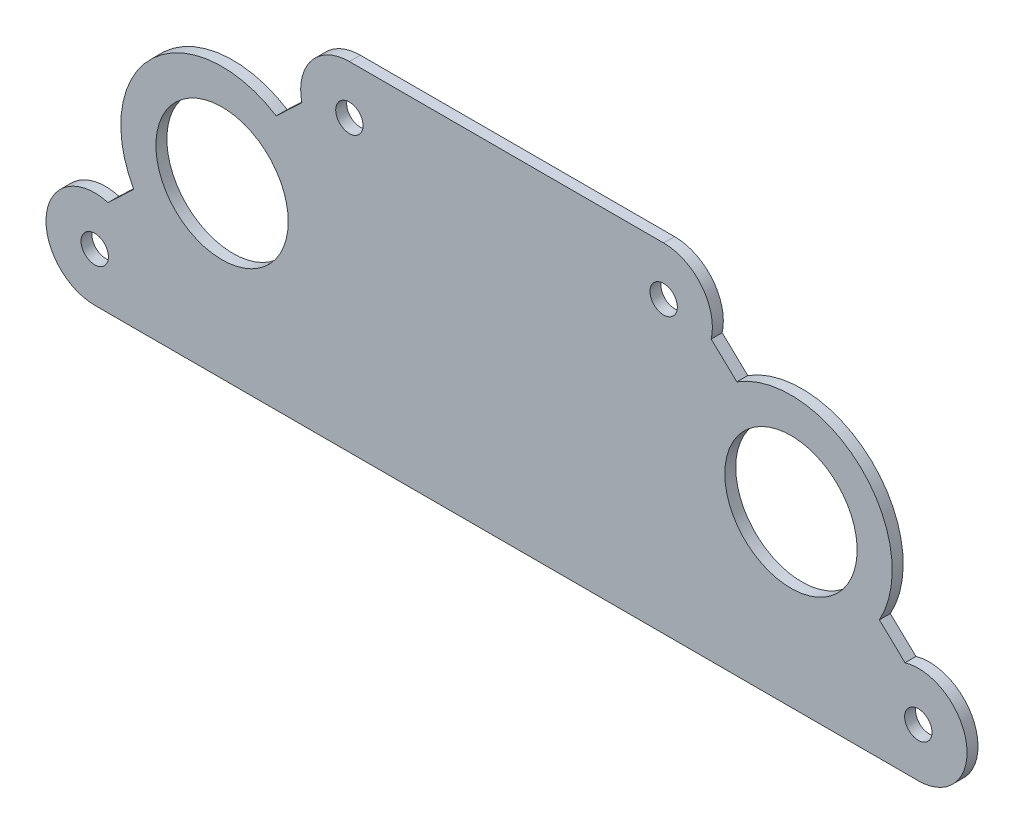
ISO-10303-21;
HEADER;
FILE_DESCRIPTION(('STEP AP214'),'2;1');
FILE_NAME('part.step','',(''),(''),'','','');
FILE_SCHEMA(('AUTOMOTIVE_DESIGN { 1 0 10303 214 1 1 1 1 }'));
ENDSEC;
DATA;
#1=APPLICATION_CONTEXT('core data for automotive mechanical design processes');
#2=APPLICATION_PROTOCOL_DEFINITION('international standard','automotive_design',2000,#1);
#3=PRODUCT_CONTEXT('',#1,'mechanical');
#4=PRODUCT('Part','Part','',(#3));
#5=PRODUCT_RELATED_PRODUCT_CATEGORY('part','',(#4));
#6=PRODUCT_DEFINITION_FORMATION('','',#4);
#7=PRODUCT_DEFINITION_CONTEXT('part definition',#1,'design');
#8=PRODUCT_DEFINITION('design','',#6,#7);
#9=PRODUCT_DEFINITION_SHAPE('','',#8);
#10=(LENGTH_UNIT() NAMED_UNIT(*) SI_UNIT(.MILLI.,.METRE.));
#11=(NAMED_UNIT(*) PLANE_ANGLE_UNIT() SI_UNIT($,.RADIAN.));
#12=(NAMED_UNIT(*) SI_UNIT($,.STERADIAN.) SOLID_ANGLE_UNIT());
#13=UNCERTAINTY_MEASURE_WITH_UNIT(LENGTH_MEASURE(1.E-05),#10,'distance_accuracy_value','');
#14=(GEOMETRIC_REPRESENTATION_CONTEXT(3) GLOBAL_UNCERTAINTY_ASSIGNED_CONTEXT((#13)) GLOBAL_UNIT_ASSIGNED_CONTEXT((#10,
#11,#12)) REPRESENTATION_CONTEXT('',''));
#15=CARTESIAN_POINT('',(0.,0.,0.));
#16=DIRECTION('',(0.,0.,1.));
#17=DIRECTION('',(1.,0.,0.));
#18=AXIS2_PLACEMENT_3D('',#15,#16,#17);
#19=CARTESIAN_POINT('',(-37.4491773298675,20.6057630346768,1.5875));
#20=DIRECTION('',(0.,0.,-1.));
#21=DIRECTION('',(-1.,0.,0.));
#22=AXIS2_PLACEMENT_3D('',#19,#20,#21);
#23=PLANE('',#22);
#24=CARTESIAN_POINT('',(-74.3479528827939,55.5216671858621,1.5875));
#25=DIRECTION('',(0.,0.,1.));
#26=DIRECTION('',(-1.,0.,0.));
#27=AXIS2_PLACEMENT_3D('',#24,#25,#26);
#28=CIRCLE('',#27,1.9812);
#29=CARTESIAN_POINT('',(-76.3291528827939,55.5216671858621,1.5875));
#30=VERTEX_POINT('',#29);
#31=EDGE_CURVE('E302',#30,#30,#28,.T.);
#32=ORIENTED_EDGE('',*,*,#31,.F.);
#33=EDGE_LOOP('',(#32));
#34=FACE_BOUND('',#33,.T.);
#35=CARTESIAN_POINT('',(-156.779774807812,20.6057630346768,1.5875));
#36=DIRECTION('',(0.,0.,1.));
#37=DIRECTION('',(1.,0.,0.));
#38=AXIS2_PLACEMENT_3D('',#35,#36,#37);
#39=CIRCLE('',#38,1.9812);
#40=CARTESIAN_POINT('',(-154.798574807812,20.6057630346768,1.5875));
#41=VERTEX_POINT('',#40);
#42=EDGE_CURVE('E314',#41,#41,#39,.T.);
#43=ORIENTED_EDGE('',*,*,#42,.F.);
#44=EDGE_LOOP('',(#43));
#45=FACE_BOUND('',#44,.T.);
#46=CARTESIAN_POINT('',(-138.330387031349,38.0637151102694,1.5875));
#47=DIRECTION('',(0.,0.,1.));
#48=DIRECTION('',(1.,0.,0.));
#49=AXIS2_PLACEMENT_3D('',#46,#47,#48);
#50=CIRCLE('',#49,9.5885);
#51=CARTESIAN_POINT('',(-128.741887031349,38.0637151102694,1.5875));
#52=VERTEX_POINT('',#51);
#53=EDGE_CURVE('E160',#52,#52,#50,.T.);
#54=ORIENTED_EDGE('',*,*,#53,.F.);
#55=EDGE_LOOP('',(#54));
#56=FACE_BOUND('',#55,.T.);
#57=CARTESIAN_POINT('',(-37.4491773298675,20.6057630346768,1.5875));
#58=DIRECTION('',(0.,0.,1.));
#59=DIRECTION('',(-1.,0.,0.));
#60=AXIS2_PLACEMENT_3D('',#57,#58,#59);
#61=CIRCLE('',#60,7.06119999999999);
#62=CARTESIAN_POINT('',(-37.4491773298676,13.5445630346768,1.5875));
#63=VERTEX_POINT('',#62);
#64=CARTESIAN_POINT('',(-39.3760586747717,27.39897094572,1.5875));
#65=VERTEX_POINT('',#64);
#66=EDGE_CURVE('E179',#63,#65,#61,.T.);
#67=ORIENTED_EDGE('',*,*,#66,.T.);
#68=DIRECTION('',(-0.726353849467055,0.68732094785798,0.));
#69=VECTOR('',#68,1.);
#70=CARTESIAN_POINT('',(-39.3760586747717,27.39897094572,1.5875));
#71=LINE('',#70,#69);
#72=CARTESIAN_POINT('',(-43.0905728629608,30.9138740670172,1.5875));
#73=VERTEX_POINT('',#72);
#74=EDGE_CURVE('E107',#65,#73,#71,.T.);
#75=ORIENTED_EDGE('',*,*,#74,.T.);
#76=CARTESIAN_POINT('',(-55.8985651063307,38.0637151102694,1.5875));
#77=DIRECTION('',(0.,0.,1.));
#78=DIRECTION('',(-1.,0.,0.));
#79=AXIS2_PLACEMENT_3D('',#76,#77,#78);
#80=CIRCLE('',#79,14.6685);
#81=CARTESIAN_POINT('',(-63.7442557100932,50.4576665060122,1.5875));
#82=VERTEX_POINT('',#81);
#83=EDGE_CURVE('E206',#73,#82,#80,.T.);
#84=ORIENTED_EDGE('',*,*,#83,.T.);
#85=DIRECTION('',(-0.726353849467056,0.687320947857978,0.));
#86=VECTOR('',#85,1.);
#87=CARTESIAN_POINT('',(-63.7442557100932,50.4576665060122,1.5875));
#88=LINE('',#87,#86);
#89=CARTESIAN_POINT('',(-67.4587698982822,53.9725696273093,1.5875));
#90=VERTEX_POINT('',#89);
#91=EDGE_CURVE('E225',#82,#90,#88,.T.);
#92=ORIENTED_EDGE('',*,*,#91,.T.);
#93=CARTESIAN_POINT('',(-74.3479528827939,55.5216671858621,1.5875));
#94=DIRECTION('',(0.,0.,1.));
#95=DIRECTION('',(-1.,0.,0.));
#96=AXIS2_PLACEMENT_3D('',#93,#94,#95);
#97=CIRCLE('',#96,7.0612);
#98=CARTESIAN_POINT('',(-74.3479528827939,62.5828671858621,1.5875));
#99=VERTEX_POINT('',#98);
#100=EDGE_CURVE('E222',#90,#99,#97,.T.);
#101=ORIENTED_EDGE('',*,*,#100,.T.);
#102=DIRECTION('',(-1.,0.,0.));
#103=VECTOR('',#102,1.);
#104=CARTESIAN_POINT('',(-119.880999254886,62.5828671858621,1.5875));
#105=LINE('',#104,#103);
#106=CARTESIAN_POINT('',(-119.880999254886,62.5828671858621,1.5875));
#107=VERTEX_POINT('',#106);
#108=EDGE_CURVE('E224',#99,#107,#105,.T.);
#109=ORIENTED_EDGE('',*,*,#108,.T.);
#110=CARTESIAN_POINT('',(-119.880999254886,55.5216671858621,1.5875));
#111=DIRECTION('',(0.,0.,1.));
#112=DIRECTION('',(1.,0.,0.));
#113=AXIS2_PLACEMENT_3D('',#110,#111,#112);
#114=CIRCLE('',#113,7.0612);
#115=CARTESIAN_POINT('',(-126.770182239397,53.9725696273093,1.5875));
#116=VERTEX_POINT('',#115);
#117=EDGE_CURVE('E227',#107,#116,#114,.T.);
#118=ORIENTED_EDGE('',*,*,#117,.T.);
#119=DIRECTION('',(-0.726353849467056,-0.687320947857978,0.));
#120=VECTOR('',#119,1.);
#121=CARTESIAN_POINT('',(-130.484696427586,50.4576665060122,1.5875));
#122=LINE('',#121,#120);
#123=CARTESIAN_POINT('',(-130.484696427586,50.4576665060122,1.5875));
#124=VERTEX_POINT('',#123);
#125=EDGE_CURVE('E233',#116,#124,#122,.T.);
#126=ORIENTED_EDGE('',*,*,#125,.T.);
#127=CARTESIAN_POINT('',(-138.330387031349,38.0637151102694,1.5875));
#128=DIRECTION('',(0.,0.,1.));
#129=DIRECTION('',(1.,0.,0.));
#130=AXIS2_PLACEMENT_3D('',#127,#128,#129);
#131=CIRCLE('',#130,14.6685);
#132=CARTESIAN_POINT('',(-151.138379274719,30.9138740670172,1.5875));
#133=VERTEX_POINT('',#132);
#134=EDGE_CURVE('E138',#124,#133,#131,.T.);
#135=ORIENTED_EDGE('',*,*,#134,.T.);
#136=DIRECTION('',(-0.726353849467055,-0.68732094785798,0.));
#137=VECTOR('',#136,1.);
#138=CARTESIAN_POINT('',(-154.852893462908,27.39897094572,1.5875));
#139=LINE('',#138,#137);
#140=CARTESIAN_POINT('',(-154.852893462908,27.39897094572,1.5875));
#141=VERTEX_POINT('',#140);
#142=EDGE_CURVE('E132',#133,#141,#139,.T.);
#143=ORIENTED_EDGE('',*,*,#142,.T.);
#144=CARTESIAN_POINT('',(-156.779774807812,20.6057630346768,1.5875));
#145=DIRECTION('',(0.,0.,1.));
#146=DIRECTION('',(1.,0.,0.));
#147=AXIS2_PLACEMENT_3D('',#144,#145,#146);
#148=CIRCLE('',#147,7.06119999999999);
#149=CARTESIAN_POINT('',(-156.779774807812,13.5445630346768,1.5875));
#150=VERTEX_POINT('',#149);
#151=EDGE_CURVE('E136',#141,#150,#148,.T.);
#152=ORIENTED_EDGE('',*,*,#151,.T.);
#153=DIRECTION('',(1.,0.,0.));
#154=VECTOR('',#153,1.);
#155=CARTESIAN_POINT('',(-156.779774807812,13.5445630346768,1.5875));
#156=LINE('',#155,#154);
#157=EDGE_CURVE('E52',#150,#63,#156,.T.);
#158=ORIENTED_EDGE('',*,*,#157,.T.);
#159=EDGE_LOOP('',(#67,#75,#84,#92,#101,#109,#118,#126,#135,#143,#152,#158));
#160=FACE_BOUND('',#159,.T.);
#161=CARTESIAN_POINT('',(-119.880999254886,55.5216671858621,1.5875));
#162=DIRECTION('',(0.,0.,1.));
#163=DIRECTION('',(1.,0.,0.));
#164=AXIS2_PLACEMENT_3D('',#161,#162,#163);
#165=CIRCLE('',#164,1.9812);
#166=CARTESIAN_POINT('',(-117.899799254886,55.5216671858621,1.5875));
#167=VERTEX_POINT('',#166);
#168=EDGE_CURVE('E320',#167,#167,#165,.T.);
#169=ORIENTED_EDGE('',*,*,#168,.F.);
#170=EDGE_LOOP('',(#169));
#171=FACE_BOUND('',#170,.T.);
#172=CARTESIAN_POINT('',(-37.4491773298675,20.6057630346768,1.5875));
#173=DIRECTION('',(0.,0.,1.));
#174=DIRECTION('',(-1.,0.,0.));
#175=AXIS2_PLACEMENT_3D('',#172,#173,#174);
#176=CIRCLE('',#175,1.9812);
#177=CARTESIAN_POINT('',(-39.4303773298675,20.6057630346768,1.5875));
#178=VERTEX_POINT('',#177);
#179=EDGE_CURVE('E308',#178,#178,#176,.T.);
#180=ORIENTED_EDGE('',*,*,#179,.F.);
#181=EDGE_LOOP('',(#180));
#182=FACE_BOUND('',#181,.T.);
#183=CARTESIAN_POINT('',(-55.8985651063307,38.0637151102694,1.5875));
#184=DIRECTION('',(0.,0.,1.));
#185=DIRECTION('',(-1.,0.,0.));
#186=AXIS2_PLACEMENT_3D('',#183,#184,#185);
#187=CIRCLE('',#186,9.5885);
#188=CARTESIAN_POINT('',(-65.4870651063307,38.0637151102694,1.5875));
#189=VERTEX_POINT('',#188);
#190=EDGE_CURVE('E293',#189,#189,#187,.T.);
#191=ORIENTED_EDGE('',*,*,#190,.F.);
#192=EDGE_LOOP('',(#191));
#193=FACE_BOUND('',#192,.T.);
#194=ADVANCED_FACE('F35',(#34,#45,#56,#160,#171,#182,#193),#23,.F.);
#195=CARTESIAN_POINT('',(-37.4491773298675,20.6057630346768,0.));
#196=DIRECTION('',(0.,0.,-1.));
#197=DIRECTION('',(-1.,0.,0.));
#198=AXIS2_PLACEMENT_3D('',#195,#196,#197);
#199=PLANE('',#198);
#200=CARTESIAN_POINT('',(-74.3479528827939,55.5216671858621,0.));
#201=DIRECTION('',(0.,0.,1.));
#202=DIRECTION('',(-1.,0.,0.));
#203=AXIS2_PLACEMENT_3D('',#200,#201,#202);
#204=CIRCLE('',#203,1.9812);
#205=CARTESIAN_POINT('',(-76.3291528827939,55.5216671858621,0.));
#206=VERTEX_POINT('',#205);
#207=EDGE_CURVE('E299',#206,#206,#204,.T.);
#208=ORIENTED_EDGE('',*,*,#207,.T.);
#209=EDGE_LOOP('',(#208));
#210=FACE_BOUND('',#209,.T.);
#211=CARTESIAN_POINT('',(-156.779774807812,20.6057630346768,0.));
#212=DIRECTION('',(0.,0.,1.));
#213=DIRECTION('',(1.,0.,0.));
#214=AXIS2_PLACEMENT_3D('',#211,#212,#213);
#215=CIRCLE('',#214,1.9812);
#216=CARTESIAN_POINT('',(-154.798574807812,20.6057630346768,0.));
#217=VERTEX_POINT('',#216);
#218=EDGE_CURVE('E311',#217,#217,#215,.T.);
#219=ORIENTED_EDGE('',*,*,#218,.T.);
#220=EDGE_LOOP('',(#219));
#221=FACE_BOUND('',#220,.T.);
#222=CARTESIAN_POINT('',(-138.330387031349,38.0637151102694,0.));
#223=DIRECTION('',(0.,0.,1.));
#224=DIRECTION('',(1.,0.,0.));
#225=AXIS2_PLACEMENT_3D('',#222,#223,#224);
#226=CIRCLE('',#225,9.5885);
#227=CARTESIAN_POINT('',(-128.741887031349,38.0637151102694,0.));
#228=VERTEX_POINT('',#227);
#229=EDGE_CURVE('E323',#228,#228,#226,.T.);
#230=ORIENTED_EDGE('',*,*,#229,.T.);
#231=EDGE_LOOP('',(#230));
#232=FACE_BOUND('',#231,.T.);
#233=CARTESIAN_POINT('',(-37.4491773298675,20.6057630346768,0.));
#234=DIRECTION('',(0.,0.,1.));
#235=DIRECTION('',(-1.,0.,0.));
#236=AXIS2_PLACEMENT_3D('',#233,#234,#235);
#237=CIRCLE('',#236,7.06119999999999);
#238=CARTESIAN_POINT('',(-37.4491773298676,13.5445630346768,0.));
#239=VERTEX_POINT('',#238);
#240=CARTESIAN_POINT('',(-39.3760586747717,27.39897094572,0.));
#241=VERTEX_POINT('',#240);
#242=EDGE_CURVE('E156',#239,#241,#237,.T.);
#243=ORIENTED_EDGE('',*,*,#242,.F.);
#244=DIRECTION('',(1.,0.,0.));
#245=VECTOR('',#244,1.);
#246=CARTESIAN_POINT('',(-156.779774807812,13.5445630346768,0.));
#247=LINE('',#246,#245);
#248=CARTESIAN_POINT('',(-156.779774807812,13.5445630346768,0.));
#249=VERTEX_POINT('',#248);
#250=EDGE_CURVE('E99',#249,#239,#247,.T.);
#251=ORIENTED_EDGE('',*,*,#250,.F.);
#252=CARTESIAN_POINT('',(-156.779774807812,20.6057630346768,0.));
#253=DIRECTION('',(0.,0.,1.));
#254=DIRECTION('',(1.,0.,0.));
#255=AXIS2_PLACEMENT_3D('',#252,#253,#254);
#256=CIRCLE('',#255,7.06119999999999);
#257=CARTESIAN_POINT('',(-154.852893462908,27.39897094572,0.));
#258=VERTEX_POINT('',#257);
#259=EDGE_CURVE('E93',#258,#249,#256,.T.);
#260=ORIENTED_EDGE('',*,*,#259,.F.);
#261=DIRECTION('',(-0.726353849467055,-0.68732094785798,0.));
#262=VECTOR('',#261,1.);
#263=CARTESIAN_POINT('',(-154.852893462908,27.39897094572,0.));
#264=LINE('',#263,#262);
#265=CARTESIAN_POINT('',(-151.138379274719,30.9138740670172,0.));
#266=VERTEX_POINT('',#265);
#267=EDGE_CURVE('E146',#266,#258,#264,.T.);
#268=ORIENTED_EDGE('',*,*,#267,.F.);
#269=CARTESIAN_POINT('',(-138.330387031349,38.0637151102694,0.));
#270=DIRECTION('',(0.,0.,1.));
#271=DIRECTION('',(1.,0.,0.));
#272=AXIS2_PLACEMENT_3D('',#269,#270,#271);
#273=CIRCLE('',#272,14.6685);
#274=CARTESIAN_POINT('',(-130.484696427586,50.4576665060122,0.));
#275=VERTEX_POINT('',#274);
#276=EDGE_CURVE('E174',#275,#266,#273,.T.);
#277=ORIENTED_EDGE('',*,*,#276,.F.);
#278=DIRECTION('',(-0.726353849467056,-0.687320947857978,0.));
#279=VECTOR('',#278,1.);
#280=CARTESIAN_POINT('',(-130.484696427586,50.4576665060122,0.));
#281=LINE('',#280,#279);
#282=CARTESIAN_POINT('',(-126.770182239397,53.9725696273093,0.));
#283=VERTEX_POINT('',#282);
#284=EDGE_CURVE('E172',#283,#275,#281,.T.);
#285=ORIENTED_EDGE('',*,*,#284,.F.);
#286=CARTESIAN_POINT('',(-119.880999254886,55.5216671858621,0.));
#287=DIRECTION('',(0.,0.,1.));
#288=DIRECTION('',(1.,0.,0.));
#289=AXIS2_PLACEMENT_3D('',#286,#287,#288);
#290=CIRCLE('',#289,7.0612);
#291=CARTESIAN_POINT('',(-119.880999254886,62.5828671858621,0.));
#292=VERTEX_POINT('',#291);
#293=EDGE_CURVE('E170',#292,#283,#290,.T.);
#294=ORIENTED_EDGE('',*,*,#293,.F.);
#295=DIRECTION('',(-1.,0.,0.));
#296=VECTOR('',#295,1.);
#297=CARTESIAN_POINT('',(-119.880999254886,62.5828671858621,0.));
#298=LINE('',#297,#296);
#299=CARTESIAN_POINT('',(-74.3479528827939,62.5828671858621,0.));
#300=VERTEX_POINT('',#299);
#301=EDGE_CURVE('E168',#300,#292,#298,.T.);
#302=ORIENTED_EDGE('',*,*,#301,.F.);
#303=CARTESIAN_POINT('',(-74.3479528827939,55.5216671858621,0.));
#304=DIRECTION('',(0.,0.,1.));
#305=DIRECTION('',(-1.,0.,0.));
#306=AXIS2_PLACEMENT_3D('',#303,#304,#305);
#307=CIRCLE('',#306,7.0612);
#308=CARTESIAN_POINT('',(-67.4587698982822,53.9725696273093,0.));
#309=VERTEX_POINT('',#308);
#310=EDGE_CURVE('E166',#309,#300,#307,.T.);
#311=ORIENTED_EDGE('',*,*,#310,.F.);
#312=DIRECTION('',(-0.726353849467056,0.687320947857978,0.));
#313=VECTOR('',#312,1.);
#314=CARTESIAN_POINT('',(-63.7442557100932,50.4576665060122,0.));
#315=LINE('',#314,#313);
#316=CARTESIAN_POINT('',(-63.7442557100932,50.4576665060122,0.));
#317=VERTEX_POINT('',#316);
#318=EDGE_CURVE('E164',#317,#309,#315,.T.);
#319=ORIENTED_EDGE('',*,*,#318,.F.);
#320=CARTESIAN_POINT('',(-55.8985651063307,38.0637151102694,0.));
#321=DIRECTION('',(0.,0.,1.));
#322=DIRECTION('',(-1.,0.,0.));
#323=AXIS2_PLACEMENT_3D('',#320,#321,#322);
#324=CIRCLE('',#323,14.6685);
#325=CARTESIAN_POINT('',(-43.0905728629608,30.9138740670172,0.));
#326=VERTEX_POINT('',#325);
#327=EDGE_CURVE('E162',#326,#317,#324,.T.);
#328=ORIENTED_EDGE('',*,*,#327,.F.);
#329=DIRECTION('',(-0.726353849467055,0.68732094785798,0.));
#330=VECTOR('',#329,1.);
#331=CARTESIAN_POINT('',(-39.3760586747717,27.39897094572,0.));
#332=LINE('',#331,#330);
#333=EDGE_CURVE('E159',#241,#326,#332,.T.);
#334=ORIENTED_EDGE('',*,*,#333,.F.);
#335=EDGE_LOOP('',(#243,#251,#260,#268,#277,#285,#294,#302,#311,#319,#328,#334));
#336=FACE_BOUND('',#335,.T.);
#337=CARTESIAN_POINT('',(-119.880999254886,55.5216671858621,0.));
#338=DIRECTION('',(0.,0.,1.));
#339=DIRECTION('',(1.,0.,0.));
#340=AXIS2_PLACEMENT_3D('',#337,#338,#339);
#341=CIRCLE('',#340,1.9812);
#342=CARTESIAN_POINT('',(-117.899799254886,55.5216671858621,0.));
#343=VERTEX_POINT('',#342);
#344=EDGE_CURVE('E317',#343,#343,#341,.T.);
#345=ORIENTED_EDGE('',*,*,#344,.T.);
#346=EDGE_LOOP('',(#345));
#347=FACE_BOUND('',#346,.T.);
#348=CARTESIAN_POINT('',(-37.4491773298675,20.6057630346768,0.));
#349=DIRECTION('',(0.,0.,1.));
#350=DIRECTION('',(-1.,0.,0.));
#351=AXIS2_PLACEMENT_3D('',#348,#349,#350);
#352=CIRCLE('',#351,1.9812);
#353=CARTESIAN_POINT('',(-39.4303773298675,20.6057630346768,0.));
#354=VERTEX_POINT('',#353);
#355=EDGE_CURVE('E305',#354,#354,#352,.T.);
#356=ORIENTED_EDGE('',*,*,#355,.T.);
#357=EDGE_LOOP('',(#356));
#358=FACE_BOUND('',#357,.T.);
#359=CARTESIAN_POINT('',(-55.8985651063307,38.0637151102694,0.));
#360=DIRECTION('',(0.,0.,1.));
#361=DIRECTION('',(-1.,0.,0.));
#362=AXIS2_PLACEMENT_3D('',#359,#360,#361);
#363=CIRCLE('',#362,9.5885);
#364=CARTESIAN_POINT('',(-65.4870651063307,38.0637151102694,0.));
#365=VERTEX_POINT('',#364);
#366=EDGE_CURVE('E296',#365,#365,#363,.T.);
#367=ORIENTED_EDGE('',*,*,#366,.T.);
#368=EDGE_LOOP('',(#367));
#369=FACE_BOUND('',#368,.T.);
#370=ADVANCED_FACE('F210',(#210,#221,#232,#336,#347,#358,#369),#199,.T.);
#371=CARTESIAN_POINT('',(-37.4491773298675,20.6057630346768,1.5875));
#372=DIRECTION('',(0.,0.,-1.));
#373=DIRECTION('',(-1.,0.,0.));
#374=AXIS2_PLACEMENT_3D('',#371,#372,#373);
#375=CYLINDRICAL_SURFACE('',#374,7.06119999999999);
#376=ORIENTED_EDGE('',*,*,#242,.T.);
#377=DIRECTION('',(0.,0.,-1.));
#378=VECTOR('',#377,1.);
#379=CARTESIAN_POINT('',(-39.3760586747717,27.39897094572,1.5875));
#380=LINE('',#379,#378);
#381=EDGE_CURVE('E11',#65,#241,#380,.T.);
#382=ORIENTED_EDGE('',*,*,#381,.F.);
#383=ORIENTED_EDGE('',*,*,#66,.F.);
#384=DIRECTION('',(0.,0.,-1.));
#385=VECTOR('',#384,1.);
#386=CARTESIAN_POINT('',(-37.4491773298676,13.5445630346768,1.5875));
#387=LINE('',#386,#385);
#388=EDGE_CURVE('E152',#63,#239,#387,.T.);
#389=ORIENTED_EDGE('',*,*,#388,.T.);
#390=EDGE_LOOP('',(#376,#382,#383,#389));
#391=FACE_BOUND('',#390,.T.);
#392=ADVANCED_FACE('F37',(#391),#375,.T.);
#393=CARTESIAN_POINT('',(-39.3760586747717,27.39897094572,1.5875));
#394=DIRECTION('',(-0.68732094785798,-0.726353849467055,0.));
#395=DIRECTION('',(0.726353849467055,-0.68732094785798,0.));
#396=AXIS2_PLACEMENT_3D('',#393,#394,#395);
#397=PLANE('',#396);
#398=ORIENTED_EDGE('',*,*,#333,.T.);
#399=DIRECTION('',(0.,0.,-1.));
#400=VECTOR('',#399,1.);
#401=CARTESIAN_POINT('',(-43.0905728629608,30.9138740670172,1.5875));
#402=LINE('',#401,#400);
#403=EDGE_CURVE('E44',#73,#326,#402,.T.);
#404=ORIENTED_EDGE('',*,*,#403,.F.);
#405=ORIENTED_EDGE('',*,*,#74,.F.);
#406=ORIENTED_EDGE('',*,*,#381,.T.);
#407=EDGE_LOOP('',(#398,#404,#405,#406));
#408=FACE_BOUND('',#407,.T.);
#409=ADVANCED_FACE('F450',(#408),#397,.F.);
#410=CARTESIAN_POINT('',(-55.8985651063307,38.0637151102694,1.5875));
#411=DIRECTION('',(0.,0.,-1.));
#412=DIRECTION('',(-1.,0.,0.));
#413=AXIS2_PLACEMENT_3D('',#410,#411,#412);
#414=CYLINDRICAL_SURFACE('',#413,14.6685);
#415=ORIENTED_EDGE('',*,*,#327,.T.);
#416=DIRECTION('',(0.,0.,-1.));
#417=VECTOR('',#416,1.);
#418=CARTESIAN_POINT('',(-63.7442557100932,50.4576665060122,1.5875));
#419=LINE('',#418,#417);
#420=EDGE_CURVE('E198',#82,#317,#419,.T.);
#421=ORIENTED_EDGE('',*,*,#420,.F.);
#422=ORIENTED_EDGE('',*,*,#83,.F.);
#423=ORIENTED_EDGE('',*,*,#403,.T.);
#424=EDGE_LOOP('',(#415,#421,#422,#423));
#425=FACE_BOUND('',#424,.T.);
#426=ADVANCED_FACE('F204',(#425),#414,.T.);
#427=CARTESIAN_POINT('',(-63.7442557100932,50.4576665060122,1.5875));
#428=DIRECTION('',(-0.687320947857978,-0.726353849467056,0.));
#429=DIRECTION('',(0.726353849467056,-0.687320947857978,0.));
#430=AXIS2_PLACEMENT_3D('',#427,#428,#429);
#431=PLANE('',#430);
#432=ORIENTED_EDGE('',*,*,#318,.T.);
#433=DIRECTION('',(0.,0.,-1.));
#434=VECTOR('',#433,1.);
#435=CARTESIAN_POINT('',(-67.4587698982822,53.9725696273093,1.5875));
#436=LINE('',#435,#434);
#437=EDGE_CURVE('E195',#90,#309,#436,.T.);
#438=ORIENTED_EDGE('',*,*,#437,.F.);
#439=ORIENTED_EDGE('',*,*,#91,.F.);
#440=ORIENTED_EDGE('',*,*,#420,.T.);
#441=EDGE_LOOP('',(#432,#438,#439,#440));
#442=FACE_BOUND('',#441,.T.);
#443=ADVANCED_FACE('F216',(#442),#431,.F.);
#444=CARTESIAN_POINT('',(-74.3479528827939,55.5216671858621,1.5875));
#445=DIRECTION('',(0.,0.,-1.));
#446=DIRECTION('',(-1.,0.,0.));
#447=AXIS2_PLACEMENT_3D('',#444,#445,#446);
#448=CYLINDRICAL_SURFACE('',#447,7.0612);
#449=ORIENTED_EDGE('',*,*,#310,.T.);
#450=DIRECTION('',(0.,0.,-1.));
#451=VECTOR('',#450,1.);
#452=CARTESIAN_POINT('',(-74.3479528827939,62.5828671858621,1.5875));
#453=LINE('',#452,#451);
#454=EDGE_CURVE('E192',#99,#300,#453,.T.);
#455=ORIENTED_EDGE('',*,*,#454,.F.);
#456=ORIENTED_EDGE('',*,*,#100,.F.);
#457=ORIENTED_EDGE('',*,*,#437,.T.);
#458=EDGE_LOOP('',(#449,#455,#456,#457));
#459=FACE_BOUND('',#458,.T.);
#460=ADVANCED_FACE('F220',(#459),#448,.T.);
#461=CARTESIAN_POINT('',(-119.880999254886,62.5828671858621,1.5875));
#462=DIRECTION('',(0.,-1.,0.));
#463=DIRECTION('',(0.,0.,-1.));
#464=AXIS2_PLACEMENT_3D('',#461,#462,#463);
#465=PLANE('',#464);
#466=ORIENTED_EDGE('',*,*,#301,.T.);
#467=DIRECTION('',(0.,0.,-1.));
#468=VECTOR('',#467,1.);
#469=CARTESIAN_POINT('',(-119.880999254886,62.5828671858621,1.5875));
#470=LINE('',#469,#468);
#471=EDGE_CURVE('E189',#107,#292,#470,.T.);
#472=ORIENTED_EDGE('',*,*,#471,.F.);
#473=ORIENTED_EDGE('',*,*,#108,.F.);
#474=ORIENTED_EDGE('',*,*,#454,.T.);
#475=EDGE_LOOP('',(#466,#472,#473,#474));
#476=FACE_BOUND('',#475,.T.);
#477=ADVANCED_FACE('F415',(#476),#465,.F.);
#478=CARTESIAN_POINT('',(-119.880999254886,55.5216671858621,1.5875));
#479=DIRECTION('',(0.,0.,-1.));
#480=DIRECTION('',(-1.,0.,0.));
#481=AXIS2_PLACEMENT_3D('',#478,#479,#480);
#482=CYLINDRICAL_SURFACE('',#481,7.0612);
#483=ORIENTED_EDGE('',*,*,#293,.T.);
#484=DIRECTION('',(0.,0.,-1.));
#485=VECTOR('',#484,1.);
#486=CARTESIAN_POINT('',(-126.770182239397,53.9725696273093,1.5875));
#487=LINE('',#486,#485);
#488=EDGE_CURVE('E186',#116,#283,#487,.T.);
#489=ORIENTED_EDGE('',*,*,#488,.F.);
#490=ORIENTED_EDGE('',*,*,#117,.F.);
#491=ORIENTED_EDGE('',*,*,#471,.T.);
#492=EDGE_LOOP('',(#483,#489,#490,#491));
#493=FACE_BOUND('',#492,.T.);
#494=ADVANCED_FACE('F406',(#493),#482,.T.);
#495=CARTESIAN_POINT('',(-130.484696427586,50.4576665060122,1.5875));
#496=DIRECTION('',(0.687320947857978,-0.726353849467056,0.));
#497=DIRECTION('',(0.726353849467056,0.687320947857978,0.));
#498=AXIS2_PLACEMENT_3D('',#495,#496,#497);
#499=PLANE('',#498);
#500=ORIENTED_EDGE('',*,*,#284,.T.);
#501=DIRECTION('',(0.,0.,-1.));
#502=VECTOR('',#501,1.);
#503=CARTESIAN_POINT('',(-130.484696427586,50.4576665060122,1.5875));
#504=LINE('',#503,#502);
#505=EDGE_CURVE('E183',#124,#275,#504,.T.);
#506=ORIENTED_EDGE('',*,*,#505,.F.);
#507=ORIENTED_EDGE('',*,*,#125,.F.);
#508=ORIENTED_EDGE('',*,*,#488,.T.);
#509=EDGE_LOOP('',(#500,#506,#507,#508));
#510=FACE_BOUND('',#509,.T.);
#511=ADVANCED_FACE('F239',(#510),#499,.F.);
#512=CARTESIAN_POINT('',(-138.330387031349,38.0637151102694,1.5875));
#513=DIRECTION('',(0.,0.,-1.));
#514=DIRECTION('',(-1.,0.,0.));
#515=AXIS2_PLACEMENT_3D('',#512,#513,#514);
#516=CYLINDRICAL_SURFACE('',#515,14.6685);
#517=ORIENTED_EDGE('',*,*,#276,.T.);
#518=DIRECTION('',(0.,0.,-1.));
#519=VECTOR('',#518,1.);
#520=CARTESIAN_POINT('',(-151.138379274719,30.9138740670172,1.5875));
#521=LINE('',#520,#519);
#522=EDGE_CURVE('E147',#133,#266,#521,.T.);
#523=ORIENTED_EDGE('',*,*,#522,.F.);
#524=ORIENTED_EDGE('',*,*,#134,.F.);
#525=ORIENTED_EDGE('',*,*,#505,.T.);
#526=EDGE_LOOP('',(#517,#523,#524,#525));
#527=FACE_BOUND('',#526,.T.);
#528=ADVANCED_FACE('F243',(#527),#516,.T.);
#529=CARTESIAN_POINT('',(-154.852893462908,27.39897094572,1.5875));
#530=DIRECTION('',(0.68732094785798,-0.726353849467055,0.));
#531=DIRECTION('',(0.726353849467055,0.68732094785798,0.));
#532=AXIS2_PLACEMENT_3D('',#529,#530,#531);
#533=PLANE('',#532);
#534=ORIENTED_EDGE('',*,*,#267,.T.);
#535=DIRECTION('',(0.,0.,-1.));
#536=VECTOR('',#535,1.);
#537=CARTESIAN_POINT('',(-154.852893462908,27.39897094572,1.5875));
#538=LINE('',#537,#536);
#539=EDGE_CURVE('E143',#141,#258,#538,.T.);
#540=ORIENTED_EDGE('',*,*,#539,.F.);
#541=ORIENTED_EDGE('',*,*,#142,.F.);
#542=ORIENTED_EDGE('',*,*,#522,.T.);
#543=EDGE_LOOP('',(#534,#540,#541,#542));
#544=FACE_BOUND('',#543,.T.);
#545=ADVANCED_FACE('F144',(#544),#533,.F.);
#546=CARTESIAN_POINT('',(-156.779774807812,20.6057630346768,1.5875));
#547=DIRECTION('',(0.,0.,-1.));
#548=DIRECTION('',(-1.,0.,0.));
#549=AXIS2_PLACEMENT_3D('',#546,#547,#548);
#550=CYLINDRICAL_SURFACE('',#549,7.06119999999999);
#551=ORIENTED_EDGE('',*,*,#259,.T.);
#552=DIRECTION('',(0.,0.,-1.));
#553=VECTOR('',#552,1.);
#554=CARTESIAN_POINT('',(-156.779774807812,13.5445630346768,1.5875));
#555=LINE('',#554,#553);
#556=EDGE_CURVE('E148',#150,#249,#555,.T.);
#557=ORIENTED_EDGE('',*,*,#556,.F.);
#558=ORIENTED_EDGE('',*,*,#151,.F.);
#559=ORIENTED_EDGE('',*,*,#539,.T.);
#560=EDGE_LOOP('',(#551,#557,#558,#559));
#561=FACE_BOUND('',#560,.T.);
#562=ADVANCED_FACE('F150',(#561),#550,.T.);
#563=CARTESIAN_POINT('',(-156.779774807812,13.5445630346768,1.5875));
#564=DIRECTION('',(0.,1.,0.));
#565=DIRECTION('',(-1.,0.,0.));
#566=AXIS2_PLACEMENT_3D('',#563,#564,#565);
#567=PLANE('',#566);
#568=ORIENTED_EDGE('',*,*,#250,.T.);
#569=ORIENTED_EDGE('',*,*,#388,.F.);
#570=ORIENTED_EDGE('',*,*,#157,.F.);
#571=ORIENTED_EDGE('',*,*,#556,.T.);
#572=EDGE_LOOP('',(#568,#569,#570,#571));
#573=FACE_BOUND('',#572,.T.);
#574=ADVANCED_FACE('F247',(#573),#567,.F.);
#575=CARTESIAN_POINT('',(-138.330387031349,38.0637151102694,1.5875));
#576=DIRECTION('',(0.,0.,-1.));
#577=DIRECTION('',(-1.,0.,0.));
#578=AXIS2_PLACEMENT_3D('',#575,#576,#577);
#579=CYLINDRICAL_SURFACE('',#578,9.5885);
#580=ORIENTED_EDGE('',*,*,#53,.T.);
#581=EDGE_LOOP('',(#580));
#582=FACE_BOUND('',#581,.T.);
#583=ORIENTED_EDGE('',*,*,#229,.F.);
#584=EDGE_LOOP('',(#583));
#585=FACE_BOUND('',#584,.T.);
#586=ADVANCED_FACE('F249',(#582,#585),#579,.F.);
#587=CARTESIAN_POINT('',(-119.880999254886,55.5216671858621,1.5875));
#588=DIRECTION('',(0.,0.,-1.));
#589=DIRECTION('',(-1.,0.,0.));
#590=AXIS2_PLACEMENT_3D('',#587,#588,#589);
#591=CYLINDRICAL_SURFACE('',#590,1.9812);
#592=ORIENTED_EDGE('',*,*,#168,.T.);
#593=EDGE_LOOP('',(#592));
#594=FACE_BOUND('',#593,.T.);
#595=ORIENTED_EDGE('',*,*,#344,.F.);
#596=EDGE_LOOP('',(#595));
#597=FACE_BOUND('',#596,.T.);
#598=ADVANCED_FACE('F255',(#594,#597),#591,.F.);
#599=CARTESIAN_POINT('',(-156.779774807812,20.6057630346768,1.5875));
#600=DIRECTION('',(0.,0.,-1.));
#601=DIRECTION('',(-1.,0.,0.));
#602=AXIS2_PLACEMENT_3D('',#599,#600,#601);
#603=CYLINDRICAL_SURFACE('',#602,1.9812);
#604=ORIENTED_EDGE('',*,*,#42,.T.);
#605=EDGE_LOOP('',(#604));
#606=FACE_BOUND('',#605,.T.);
#607=ORIENTED_EDGE('',*,*,#218,.F.);
#608=EDGE_LOOP('',(#607));
#609=FACE_BOUND('',#608,.T.);
#610=ADVANCED_FACE('F272',(#606,#609),#603,.F.);
#611=CARTESIAN_POINT('',(-37.4491773298675,20.6057630346768,1.5875));
#612=DIRECTION('',(0.,0.,-1.));
#613=DIRECTION('',(-1.,0.,0.));
#614=AXIS2_PLACEMENT_3D('',#611,#612,#613);
#615=CYLINDRICAL_SURFACE('',#614,1.9812);
#616=ORIENTED_EDGE('',*,*,#179,.T.);
#617=EDGE_LOOP('',(#616));
#618=FACE_BOUND('',#617,.T.);
#619=ORIENTED_EDGE('',*,*,#355,.F.);
#620=EDGE_LOOP('',(#619));
#621=FACE_BOUND('',#620,.T.);
#622=ADVANCED_FACE('F276',(#618,#621),#615,.F.);
#623=CARTESIAN_POINT('',(-74.3479528827939,55.5216671858621,1.5875));
#624=DIRECTION('',(0.,0.,-1.));
#625=DIRECTION('',(-1.,0.,0.));
#626=AXIS2_PLACEMENT_3D('',#623,#624,#625);
#627=CYLINDRICAL_SURFACE('',#626,1.9812);
#628=ORIENTED_EDGE('',*,*,#31,.T.);
#629=EDGE_LOOP('',(#628));
#630=FACE_BOUND('',#629,.T.);
#631=ORIENTED_EDGE('',*,*,#207,.F.);
#632=EDGE_LOOP('',(#631));
#633=FACE_BOUND('',#632,.T.);
#634=ADVANCED_FACE('F280',(#630,#633),#627,.F.);
#635=CARTESIAN_POINT('',(-55.8985651063307,38.0637151102694,1.5875));
#636=DIRECTION('',(0.,0.,-1.));
#637=DIRECTION('',(-1.,0.,0.));
#638=AXIS2_PLACEMENT_3D('',#635,#636,#637);
#639=CYLINDRICAL_SURFACE('',#638,9.5885);
#640=ORIENTED_EDGE('',*,*,#190,.T.);
#641=EDGE_LOOP('',(#640));
#642=FACE_BOUND('',#641,.T.);
#643=ORIENTED_EDGE('',*,*,#366,.F.);
#644=EDGE_LOOP('',(#643));
#645=FACE_BOUND('',#644,.T.);
#646=ADVANCED_FACE('F284',(#642,#645),#639,.F.);
#647=CLOSED_SHELL('',(#194,#370,#392,#409,#426,#443,#460,#477,#494,#511,#528,#545,#562,#574,
#586,#598,#610,#622,#634,#646));
#648=MANIFOLD_SOLID_BREP('B2',#647);
#649=ADVANCED_BREP_SHAPE_REPRESENTATION('',(#18,#648),#14);
#650=SHAPE_DEFINITION_REPRESENTATION(#9,#649);
ENDSEC;
END-ISO-10303-21;
